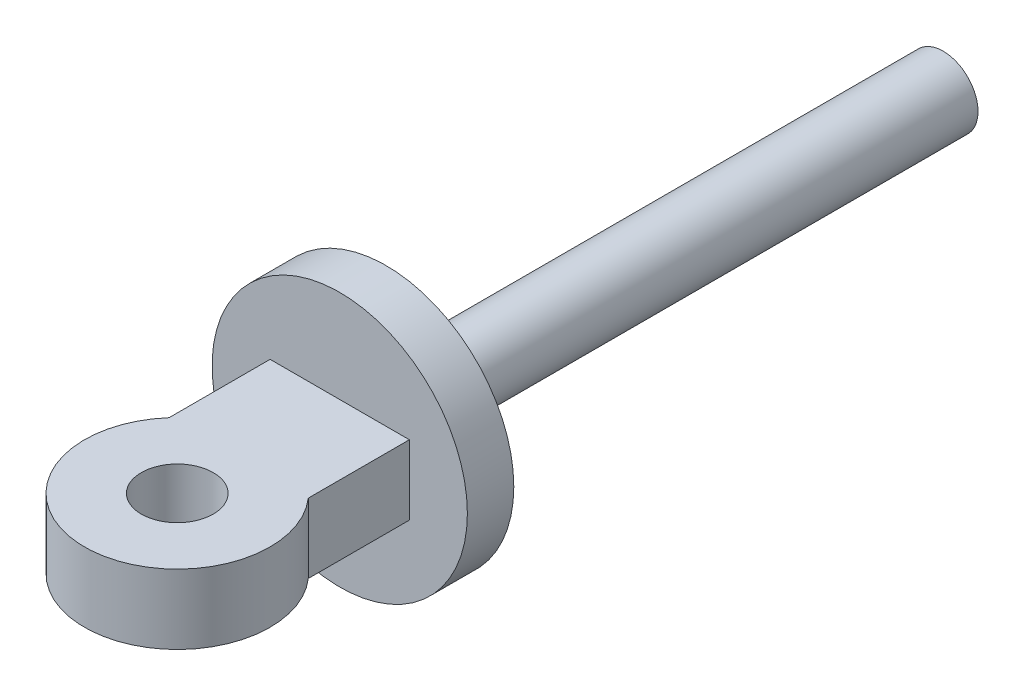
ISO-10303-21;
HEADER;
FILE_DESCRIPTION(('STEP AP214'),'2;1');
FILE_NAME('part.step','',(''),(''),'','','');
FILE_SCHEMA(('AUTOMOTIVE_DESIGN { 1 0 10303 214 1 1 1 1 }'));
ENDSEC;
DATA;
#1=APPLICATION_CONTEXT('core data for automotive mechanical design processes');
#2=APPLICATION_PROTOCOL_DEFINITION('international standard','automotive_design',2000,#1);
#3=PRODUCT_CONTEXT('',#1,'mechanical');
#4=PRODUCT('Part','Part','',(#3));
#5=PRODUCT_RELATED_PRODUCT_CATEGORY('part','',(#4));
#6=PRODUCT_DEFINITION_FORMATION('','',#4);
#7=PRODUCT_DEFINITION_CONTEXT('part definition',#1,'design');
#8=PRODUCT_DEFINITION('design','',#6,#7);
#9=PRODUCT_DEFINITION_SHAPE('','',#8);
#10=(LENGTH_UNIT() NAMED_UNIT(*) SI_UNIT(.MILLI.,.METRE.));
#11=(NAMED_UNIT(*) PLANE_ANGLE_UNIT() SI_UNIT($,.RADIAN.));
#12=(NAMED_UNIT(*) SI_UNIT($,.STERADIAN.) SOLID_ANGLE_UNIT());
#13=UNCERTAINTY_MEASURE_WITH_UNIT(LENGTH_MEASURE(1.E-05),#10,'distance_accuracy_value','');
#14=(GEOMETRIC_REPRESENTATION_CONTEXT(3) GLOBAL_UNCERTAINTY_ASSIGNED_CONTEXT((#13)) GLOBAL_UNIT_ASSIGNED_CONTEXT((#10,
#11,#12)) REPRESENTATION_CONTEXT('',''));
#15=CARTESIAN_POINT('',(0.,0.,0.));
#16=DIRECTION('',(0.,0.,1.));
#17=DIRECTION('',(1.,0.,0.));
#18=AXIS2_PLACEMENT_3D('',#15,#16,#17);
#19=CARTESIAN_POINT('',(0.,-326.,43.));
#20=DIRECTION('',(0.,0.,1.));
#21=DIRECTION('',(1.,0.,0.));
#22=AXIS2_PLACEMENT_3D('',#19,#20,#21);
#23=PLANE('',#22);
#24=CARTESIAN_POINT('',(0.,-326.,43.));
#25=DIRECTION('',(0.,0.,-1.));
#26=DIRECTION('',(1.,0.,0.));
#27=AXIS2_PLACEMENT_3D('',#24,#25,#26);
#28=CIRCLE('',#27,3.);
#29=CARTESIAN_POINT('',(3.,-326.,43.));
#30=VERTEX_POINT('',#29);
#31=EDGE_CURVE('E11',#30,#30,#28,.T.);
#32=ORIENTED_EDGE('',*,*,#31,.T.);
#33=EDGE_LOOP('',(#32));
#34=FACE_BOUND('',#33,.T.);
#35=ADVANCED_FACE('F16',(#34),#23,.F.);
#36=CARTESIAN_POINT('',(0.,-326.,43.));
#37=DIRECTION('',(0.,0.,1.));
#38=DIRECTION('',(1.,0.,0.));
#39=AXIS2_PLACEMENT_3D('',#36,#37,#38);
#40=CYLINDRICAL_SURFACE('',#39,3.);
#41=DIRECTION('',(0.,0.,1.));
#42=VECTOR('',#41,1.);
#43=CARTESIAN_POINT('',(3.,-326.,43.));
#44=LINE('',#43,#42);
#45=CARTESIAN_POINT('',(3.,-326.,91.));
#46=VERTEX_POINT('',#45);
#47=EDGE_CURVE('E25',#30,#46,#44,.T.);
#48=ORIENTED_EDGE('',*,*,#47,.F.);
#49=ORIENTED_EDGE('',*,*,#31,.F.);
#50=ORIENTED_EDGE('',*,*,#47,.T.);
#51=CARTESIAN_POINT('',(0.,-326.,91.));
#52=DIRECTION('',(0.,0.,-1.));
#53=DIRECTION('',(1.,0.,0.));
#54=AXIS2_PLACEMENT_3D('',#51,#52,#53);
#55=CIRCLE('',#54,3.);
#56=EDGE_CURVE('E74',#46,#46,#55,.T.);
#57=ORIENTED_EDGE('',*,*,#56,.T.);
#58=EDGE_LOOP('',(#48,#49,#50,#57));
#59=FACE_BOUND('',#58,.T.);
#60=ADVANCED_FACE('F89',(#59),#40,.T.);
#61=CARTESIAN_POINT('',(0.,-326.,91.));
#62=DIRECTION('',(0.,0.,1.));
#63=DIRECTION('',(1.,0.,0.));
#64=AXIS2_PLACEMENT_3D('',#61,#62,#63);
#65=PLANE('',#64);
#66=ORIENTED_EDGE('',*,*,#56,.F.);
#67=EDGE_LOOP('',(#66));
#68=FACE_BOUND('',#67,.T.);
#69=CARTESIAN_POINT('',(0.,-326.,91.));
#70=DIRECTION('',(0.,0.,-1.));
#71=DIRECTION('',(1.,0.,0.));
#72=AXIS2_PLACEMENT_3D('',#69,#70,#71);
#73=CIRCLE('',#72,11.);
#74=CARTESIAN_POINT('',(11.,-326.,91.));
#75=VERTEX_POINT('',#74);
#76=EDGE_CURVE('E69',#75,#75,#73,.T.);
#77=ORIENTED_EDGE('',*,*,#76,.T.);
#78=EDGE_LOOP('',(#77));
#79=FACE_BOUND('',#78,.T.);
#80=ADVANCED_FACE('F70',(#68,#79),#65,.F.);
#81=CARTESIAN_POINT('',(0.,-326.,91.));
#82=DIRECTION('',(0.,0.,1.));
#83=DIRECTION('',(1.,0.,0.));
#84=AXIS2_PLACEMENT_3D('',#81,#82,#83);
#85=CYLINDRICAL_SURFACE('',#84,11.);
#86=DIRECTION('',(0.,0.,1.));
#87=VECTOR('',#86,1.);
#88=CARTESIAN_POINT('',(11.,-326.,91.));
#89=LINE('',#88,#87);
#90=CARTESIAN_POINT('',(11.,-326.,95.));
#91=VERTEX_POINT('',#90);
#92=EDGE_CURVE('E75',#75,#91,#89,.T.);
#93=ORIENTED_EDGE('',*,*,#92,.F.);
#94=ORIENTED_EDGE('',*,*,#76,.F.);
#95=ORIENTED_EDGE('',*,*,#92,.T.);
#96=CARTESIAN_POINT('',(0.,-326.,95.));
#97=DIRECTION('',(0.,0.,-1.));
#98=DIRECTION('',(1.,0.,0.));
#99=AXIS2_PLACEMENT_3D('',#96,#97,#98);
#100=CIRCLE('',#99,11.);
#101=EDGE_CURVE('E282',#91,#91,#100,.T.);
#102=ORIENTED_EDGE('',*,*,#101,.T.);
#103=EDGE_LOOP('',(#93,#94,#95,#102));
#104=FACE_BOUND('',#103,.T.);
#105=ADVANCED_FACE('F93',(#104),#85,.T.);
#106=CARTESIAN_POINT('',(0.,-331.,109.));
#107=DIRECTION('',(0.,1.,0.));
#108=DIRECTION('',(1.,0.,0.));
#109=AXIS2_PLACEMENT_3D('',#106,#107,#108);
#110=CYLINDRICAL_SURFACE('',#109,3.1);
#111=CARTESIAN_POINT('',(0.,-323.,109.));
#112=DIRECTION('',(0.,-1.,0.));
#113=DIRECTION('',(1.,0.,0.));
#114=AXIS2_PLACEMENT_3D('',#111,#112,#113);
#115=CIRCLE('',#114,3.1);
#116=CARTESIAN_POINT('',(3.1,-323.,109.));
#117=VERTEX_POINT('',#116);
#118=EDGE_CURVE('E283',#117,#117,#115,.T.);
#119=ORIENTED_EDGE('',*,*,#118,.F.);
#120=DIRECTION('',(0.,1.,0.));
#121=VECTOR('',#120,1.);
#122=CARTESIAN_POINT('',(3.1,-331.,109.));
#123=LINE('',#122,#121);
#124=CARTESIAN_POINT('',(3.1,-329.,109.));
#125=VERTEX_POINT('',#124);
#126=EDGE_CURVE('E82',#125,#117,#123,.T.);
#127=ORIENTED_EDGE('',*,*,#126,.F.);
#128=CARTESIAN_POINT('',(0.,-329.,109.));
#129=DIRECTION('',(0.,-1.,0.));
#130=DIRECTION('',(1.,0.,0.));
#131=AXIS2_PLACEMENT_3D('',#128,#129,#130);
#132=CIRCLE('',#131,3.1);
#133=EDGE_CURVE('E288',#125,#125,#132,.T.);
#134=ORIENTED_EDGE('',*,*,#133,.T.);
#135=ORIENTED_EDGE('',*,*,#126,.T.);
#136=EDGE_LOOP('',(#119,#127,#134,#135));
#137=FACE_BOUND('',#136,.T.);
#138=ADVANCED_FACE('F100',(#137),#110,.F.);
#139=CARTESIAN_POINT('',(0.,-326.,95.));
#140=DIRECTION('',(0.,0.,1.));
#141=DIRECTION('',(1.,0.,0.));
#142=AXIS2_PLACEMENT_3D('',#139,#140,#141);
#143=PLANE('',#142);
#144=DIRECTION('',(0.,1.,0.));
#145=VECTOR('',#144,1.);
#146=CARTESIAN_POINT('',(-6.,-324.5,95.));
#147=LINE('',#146,#145);
#148=CARTESIAN_POINT('',(-6.,-329.,95.));
#149=VERTEX_POINT('',#148);
#150=CARTESIAN_POINT('',(-6.,-323.,95.));
#151=VERTEX_POINT('',#150);
#152=EDGE_CURVE('E255',#149,#151,#147,.T.);
#153=ORIENTED_EDGE('',*,*,#152,.T.);
#154=DIRECTION('',(-1.,0.,0.));
#155=VECTOR('',#154,1.);
#156=CARTESIAN_POINT('',(0.,-323.,95.));
#157=LINE('',#156,#155);
#158=CARTESIAN_POINT('',(6.,-323.,95.));
#159=VERTEX_POINT('',#158);
#160=EDGE_CURVE('E298',#159,#151,#157,.T.);
#161=ORIENTED_EDGE('',*,*,#160,.F.);
#162=DIRECTION('',(0.,1.,0.));
#163=VECTOR('',#162,1.);
#164=CARTESIAN_POINT('',(6.,-324.5,95.));
#165=LINE('',#164,#163);
#166=CARTESIAN_POINT('',(6.,-329.,95.));
#167=VERTEX_POINT('',#166);
#168=EDGE_CURVE('E280',#167,#159,#165,.T.);
#169=ORIENTED_EDGE('',*,*,#168,.F.);
#170=DIRECTION('',(-1.,0.,0.));
#171=VECTOR('',#170,1.);
#172=CARTESIAN_POINT('',(0.,-329.,95.));
#173=LINE('',#172,#171);
#174=EDGE_CURVE('E260',#167,#149,#173,.T.);
#175=ORIENTED_EDGE('',*,*,#174,.T.);
#176=EDGE_LOOP('',(#153,#161,#169,#175));
#177=FACE_BOUND('',#176,.T.);
#178=ORIENTED_EDGE('',*,*,#101,.F.);
#179=EDGE_LOOP('',(#178));
#180=FACE_BOUND('',#179,.T.);
#181=ADVANCED_FACE('F138',(#177,#180),#143,.T.);
#182=CARTESIAN_POINT('',(6.,-323.,93.));
#183=DIRECTION('',(1.,0.,0.));
#184=DIRECTION('',(0.,1.,0.));
#185=AXIS2_PLACEMENT_3D('',#182,#183,#184);
#186=PLANE('',#185);
#187=DIRECTION('',(0.,1.,0.));
#188=VECTOR('',#187,1.);
#189=CARTESIAN_POINT('',(6.,-329.,103.70849737787));
#190=LINE('',#189,#188);
#191=CARTESIAN_POINT('',(6.,-329.,103.70849737787));
#192=VERTEX_POINT('',#191);
#193=CARTESIAN_POINT('',(6.,-323.,103.70849737787));
#194=VERTEX_POINT('',#193);
#195=EDGE_CURVE('E277',#192,#194,#190,.T.);
#196=ORIENTED_EDGE('',*,*,#195,.F.);
#197=DIRECTION('',(0.,0.,1.));
#198=VECTOR('',#197,1.);
#199=CARTESIAN_POINT('',(6.,-329.,93.));
#200=LINE('',#199,#198);
#201=EDGE_CURVE('E261',#167,#192,#200,.T.);
#202=ORIENTED_EDGE('',*,*,#201,.F.);
#203=ORIENTED_EDGE('',*,*,#168,.T.);
#204=DIRECTION('',(0.,0.,1.));
#205=VECTOR('',#204,1.);
#206=CARTESIAN_POINT('',(6.,-323.,93.));
#207=LINE('',#206,#205);
#208=EDGE_CURVE('E301',#159,#194,#207,.T.);
#209=ORIENTED_EDGE('',*,*,#208,.T.);
#210=EDGE_LOOP('',(#196,#202,#203,#209));
#211=FACE_BOUND('',#210,.T.);
#212=ADVANCED_FACE('F149',(#211),#186,.T.);
#213=CARTESIAN_POINT('',(0.,-323.,109.));
#214=DIRECTION('',(0.,1.,0.));
#215=DIRECTION('',(0.,0.,-1.));
#216=AXIS2_PLACEMENT_3D('',#213,#214,#215);
#217=PLANE('',#216);
#218=ORIENTED_EDGE('',*,*,#118,.T.);
#219=EDGE_LOOP('',(#218));
#220=FACE_BOUND('',#219,.T.);
#221=ORIENTED_EDGE('',*,*,#208,.F.);
#222=ORIENTED_EDGE('',*,*,#160,.T.);
#223=DIRECTION('',(0.,0.,1.));
#224=VECTOR('',#223,1.);
#225=CARTESIAN_POINT('',(-6.,-323.,93.));
#226=LINE('',#225,#224);
#227=CARTESIAN_POINT('',(-6.,-323.,103.70849737787));
#228=VERTEX_POINT('',#227);
#229=EDGE_CURVE('E292',#151,#228,#226,.T.);
#230=ORIENTED_EDGE('',*,*,#229,.T.);
#231=CARTESIAN_POINT('',(0.,-323.,109.));
#232=DIRECTION('',(0.,1.,0.));
#233=DIRECTION('',(-0.750000000000073,0.,-0.661437827766065));
#234=AXIS2_PLACEMENT_3D('',#231,#232,#233);
#235=CIRCLE('',#234,8.);
#236=EDGE_CURVE('E271',#228,#194,#235,.T.);
#237=ORIENTED_EDGE('',*,*,#236,.T.);
#238=EDGE_LOOP('',(#221,#222,#230,#237));
#239=FACE_BOUND('',#238,.T.);
#240=ADVANCED_FACE('F160',(#220,#239),#217,.T.);
#241=CARTESIAN_POINT('',(-6.,-323.,93.));
#242=DIRECTION('',(1.,0.,0.));
#243=DIRECTION('',(0.,1.,0.));
#244=AXIS2_PLACEMENT_3D('',#241,#242,#243);
#245=PLANE('',#244);
#246=ORIENTED_EDGE('',*,*,#229,.F.);
#247=ORIENTED_EDGE('',*,*,#152,.F.);
#248=DIRECTION('',(0.,0.,1.));
#249=VECTOR('',#248,1.);
#250=CARTESIAN_POINT('',(-6.,-329.,93.));
#251=LINE('',#250,#249);
#252=CARTESIAN_POINT('',(-6.,-329.,103.70849737787));
#253=VERTEX_POINT('',#252);
#254=EDGE_CURVE('E248',#149,#253,#251,.T.);
#255=ORIENTED_EDGE('',*,*,#254,.T.);
#256=DIRECTION('',(0.,1.,0.));
#257=VECTOR('',#256,1.);
#258=CARTESIAN_POINT('',(-6.,-329.,103.70849737787));
#259=LINE('',#258,#257);
#260=EDGE_CURVE('E252',#253,#228,#259,.T.);
#261=ORIENTED_EDGE('',*,*,#260,.T.);
#262=EDGE_LOOP('',(#246,#247,#255,#261));
#263=FACE_BOUND('',#262,.T.);
#264=ADVANCED_FACE('F171',(#263),#245,.F.);
#265=CARTESIAN_POINT('',(0.,-329.,109.));
#266=DIRECTION('',(0.,1.,0.));
#267=DIRECTION('',(0.,0.,-1.));
#268=AXIS2_PLACEMENT_3D('',#265,#266,#267);
#269=PLANE('',#268);
#270=ORIENTED_EDGE('',*,*,#133,.F.);
#271=EDGE_LOOP('',(#270));
#272=FACE_BOUND('',#271,.T.);
#273=ORIENTED_EDGE('',*,*,#201,.T.);
#274=CARTESIAN_POINT('',(0.,-329.,109.));
#275=DIRECTION('',(0.,-1.,0.));
#276=DIRECTION('',(0.750000000000073,0.,-0.661437827766065));
#277=AXIS2_PLACEMENT_3D('',#274,#275,#276);
#278=CIRCLE('',#277,8.);
#279=EDGE_CURVE('E264',#192,#253,#278,.T.);
#280=ORIENTED_EDGE('',*,*,#279,.T.);
#281=ORIENTED_EDGE('',*,*,#254,.F.);
#282=ORIENTED_EDGE('',*,*,#174,.F.);
#283=EDGE_LOOP('',(#273,#280,#281,#282));
#284=FACE_BOUND('',#283,.T.);
#285=ADVANCED_FACE('F182',(#272,#284),#269,.F.);
#286=CARTESIAN_POINT('',(0.,-329.,109.));
#287=DIRECTION('',(0.,1.,0.));
#288=DIRECTION('',(1.,0.,0.));
#289=AXIS2_PLACEMENT_3D('',#286,#287,#288);
#290=CYLINDRICAL_SURFACE('',#289,8.);
#291=ORIENTED_EDGE('',*,*,#195,.T.);
#292=ORIENTED_EDGE('',*,*,#236,.F.);
#293=ORIENTED_EDGE('',*,*,#260,.F.);
#294=ORIENTED_EDGE('',*,*,#279,.F.);
#295=EDGE_LOOP('',(#291,#292,#293,#294));
#296=FACE_BOUND('',#295,.T.);
#297=ADVANCED_FACE('F193',(#296),#290,.T.);
#298=CLOSED_SHELL('',(#35,#60,#80,#105,#138,#181,#212,#240,#264,#285,#297));
#299=MANIFOLD_SOLID_BREP('B1',#298);
#300=ADVANCED_BREP_SHAPE_REPRESENTATION('',(#18,#299),#14);
#301=SHAPE_DEFINITION_REPRESENTATION(#9,#300);
ENDSEC;
END-ISO-10303-21;
